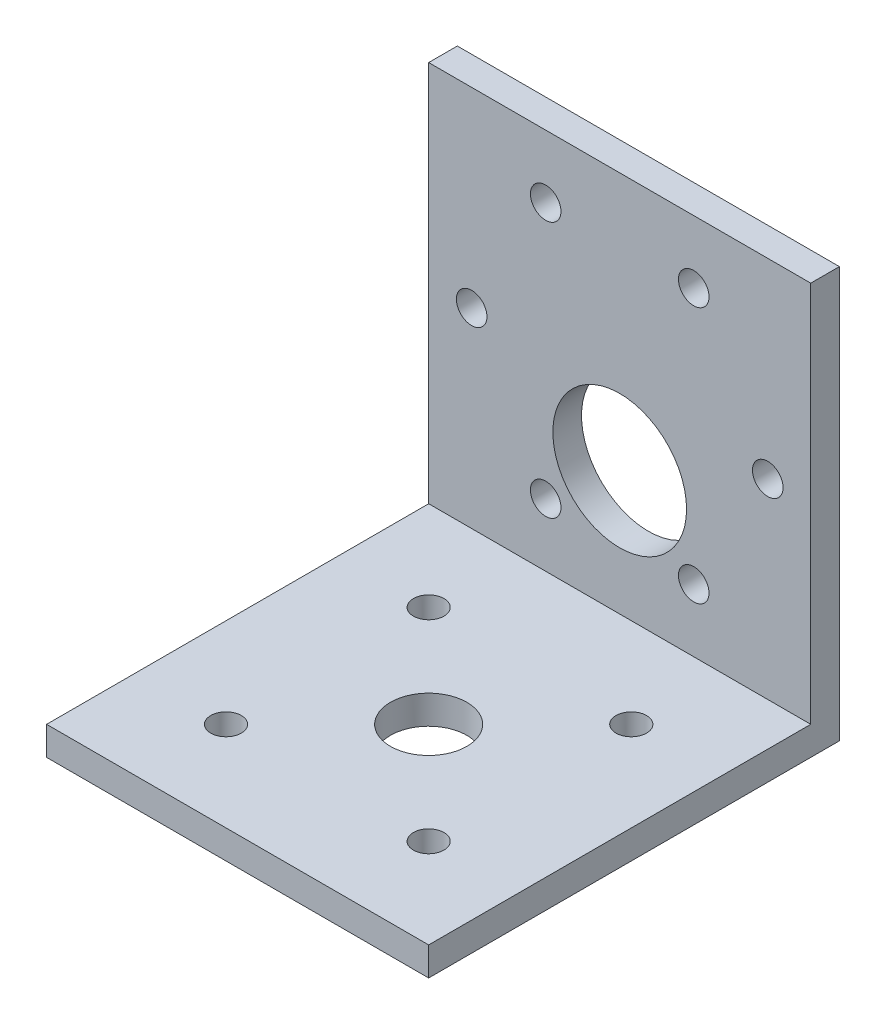
ISO-10303-21;
HEADER;
FILE_DESCRIPTION(('STEP AP214'),'2;1');
FILE_NAME('part.step','',(''),(''),'','','');
FILE_SCHEMA(('AUTOMOTIVE_DESIGN { 1 0 10303 214 1 1 1 1 }'));
ENDSEC;
DATA;
#1=APPLICATION_CONTEXT('core data for automotive mechanical design processes');
#2=APPLICATION_PROTOCOL_DEFINITION('international standard','automotive_design',2000,#1);
#3=PRODUCT_CONTEXT('',#1,'mechanical');
#4=PRODUCT('Part','Part','',(#3));
#5=PRODUCT_RELATED_PRODUCT_CATEGORY('part','',(#4));
#6=PRODUCT_DEFINITION_FORMATION('','',#4);
#7=PRODUCT_DEFINITION_CONTEXT('part definition',#1,'design');
#8=PRODUCT_DEFINITION('design','',#6,#7);
#9=PRODUCT_DEFINITION_SHAPE('','',#8);
#10=(LENGTH_UNIT() NAMED_UNIT(*) SI_UNIT(.MILLI.,.METRE.));
#11=(NAMED_UNIT(*) PLANE_ANGLE_UNIT() SI_UNIT($,.RADIAN.));
#12=(NAMED_UNIT(*) SI_UNIT($,.STERADIAN.) SOLID_ANGLE_UNIT());
#13=UNCERTAINTY_MEASURE_WITH_UNIT(LENGTH_MEASURE(1.E-05),#10,'distance_accuracy_value','');
#14=(GEOMETRIC_REPRESENTATION_CONTEXT(3) GLOBAL_UNCERTAINTY_ASSIGNED_CONTEXT((#13)) GLOBAL_UNIT_ASSIGNED_CONTEXT((#10,
#11,#12)) REPRESENTATION_CONTEXT('',''));
#15=CARTESIAN_POINT('',(0.,0.,0.));
#16=DIRECTION('',(0.,0.,1.));
#17=DIRECTION('',(1.,0.,0.));
#18=AXIS2_PLACEMENT_3D('',#15,#16,#17);
#19=CARTESIAN_POINT('',(0.,0.,3.));
#20=DIRECTION('',(0.,0.,1.));
#21=DIRECTION('',(1.,0.,0.));
#22=AXIS2_PLACEMENT_3D('',#19,#20,#21);
#23=PLANE('',#22);
#24=CARTESIAN_POINT('',(27.75,-33.4233937586588,3.));
#25=DIRECTION('',(0.,0.,1.));
#26=DIRECTION('',(1.,0.,0.));
#27=AXIS2_PLACEMENT_3D('',#24,#25,#26);
#28=CIRCLE('',#27,1.60000000000002);
#29=CARTESIAN_POINT('',(29.35,-33.4233937586588,3.));
#30=VERTEX_POINT('',#29);
#31=EDGE_CURVE('E288',#30,#30,#28,.T.);
#32=ORIENTED_EDGE('',*,*,#31,.F.);
#33=EDGE_LOOP('',(#32));
#34=FACE_BOUND('',#33,.T.);
#35=CARTESIAN_POINT('',(35.5,-20.,3.));
#36=DIRECTION('',(0.,0.,-1.));
#37=DIRECTION('',(-1.,0.,0.));
#38=AXIS2_PLACEMENT_3D('',#35,#36,#37);
#39=CIRCLE('',#38,1.6);
#40=CARTESIAN_POINT('',(33.9,-20.,3.));
#41=VERTEX_POINT('',#40);
#42=EDGE_CURVE('E296',#41,#41,#39,.T.);
#43=ORIENTED_EDGE('',*,*,#42,.T.);
#44=EDGE_LOOP('',(#43));
#45=FACE_BOUND('',#44,.T.);
#46=CARTESIAN_POINT('',(27.75,-6.57660624134121,3.));
#47=DIRECTION('',(0.,0.,-1.));
#48=DIRECTION('',(-1.,0.,0.));
#49=AXIS2_PLACEMENT_3D('',#46,#47,#48);
#50=CIRCLE('',#49,1.60000000000001);
#51=CARTESIAN_POINT('',(26.15,-6.57660624134121,3.));
#52=VERTEX_POINT('',#51);
#53=EDGE_CURVE('E304',#52,#52,#50,.T.);
#54=ORIENTED_EDGE('',*,*,#53,.T.);
#55=EDGE_LOOP('',(#54));
#56=FACE_BOUND('',#55,.T.);
#57=DIRECTION('',(0.,-1.,0.));
#58=VECTOR('',#57,1.);
#59=CARTESIAN_POINT('',(40.,0.,3.));
#60=LINE('',#59,#58);
#61=CARTESIAN_POINT('',(40.,0.,3.));
#62=VERTEX_POINT('',#61);
#63=CARTESIAN_POINT('',(40.,-40.,3.));
#64=VERTEX_POINT('',#63);
#65=EDGE_CURVE('E182',#62,#64,#60,.T.);
#66=ORIENTED_EDGE('',*,*,#65,.F.);
#67=DIRECTION('',(1.,0.,0.));
#68=VECTOR('',#67,1.);
#69=CARTESIAN_POINT('',(0.,0.,3.));
#70=LINE('',#69,#68);
#71=CARTESIAN_POINT('',(0.,0.,3.));
#72=VERTEX_POINT('',#71);
#73=EDGE_CURVE('E190',#72,#62,#70,.T.);
#74=ORIENTED_EDGE('',*,*,#73,.F.);
#75=DIRECTION('',(0.,-1.,0.));
#76=VECTOR('',#75,1.);
#77=CARTESIAN_POINT('',(0.,0.,3.));
#78=LINE('',#77,#76);
#79=CARTESIAN_POINT('',(0.,-40.,3.));
#80=VERTEX_POINT('',#79);
#81=EDGE_CURVE('E197',#72,#80,#78,.T.);
#82=ORIENTED_EDGE('',*,*,#81,.T.);
#83=DIRECTION('',(1.,0.,0.));
#84=VECTOR('',#83,1.);
#85=CARTESIAN_POINT('',(0.,-40.,3.));
#86=LINE('',#85,#84);
#87=EDGE_CURVE('E172',#80,#64,#86,.T.);
#88=ORIENTED_EDGE('',*,*,#87,.T.);
#89=EDGE_LOOP('',(#66,#74,#82,#88));
#90=FACE_BOUND('',#89,.T.);
#91=CARTESIAN_POINT('',(20.,-27.,3.));
#92=DIRECTION('',(0.,0.,1.));
#93=DIRECTION('',(1.,0.,0.));
#94=AXIS2_PLACEMENT_3D('',#91,#92,#93);
#95=CIRCLE('',#94,7.);
#96=CARTESIAN_POINT('',(27.,-27.,3.));
#97=VERTEX_POINT('',#96);
#98=EDGE_CURVE('E192',#97,#97,#95,.T.);
#99=ORIENTED_EDGE('',*,*,#98,.F.);
#100=EDGE_LOOP('',(#99));
#101=FACE_BOUND('',#100,.T.);
#102=CARTESIAN_POINT('',(12.25,-6.57660624134121,3.));
#103=DIRECTION('',(0.,0.,1.));
#104=DIRECTION('',(1.,0.,0.));
#105=AXIS2_PLACEMENT_3D('',#102,#103,#104);
#106=CIRCLE('',#105,1.6);
#107=CARTESIAN_POINT('',(13.85,-6.57660624134121,3.));
#108=VERTEX_POINT('',#107);
#109=EDGE_CURVE('E209',#108,#108,#106,.T.);
#110=ORIENTED_EDGE('',*,*,#109,.F.);
#111=EDGE_LOOP('',(#110));
#112=FACE_BOUND('',#111,.T.);
#113=CARTESIAN_POINT('',(12.25,-33.4233937586588,3.));
#114=DIRECTION('',(0.,0.,-1.));
#115=DIRECTION('',(-1.,0.,0.));
#116=AXIS2_PLACEMENT_3D('',#113,#114,#115);
#117=CIRCLE('',#116,1.60000000000001);
#118=CARTESIAN_POINT('',(10.65,-33.4233937586588,3.));
#119=VERTEX_POINT('',#118);
#120=EDGE_CURVE('E280',#119,#119,#117,.T.);
#121=ORIENTED_EDGE('',*,*,#120,.T.);
#122=EDGE_LOOP('',(#121));
#123=FACE_BOUND('',#122,.T.);
#124=CARTESIAN_POINT('',(4.5,-20.,3.));
#125=DIRECTION('',(0.,0.,1.));
#126=DIRECTION('',(1.,0.,0.));
#127=AXIS2_PLACEMENT_3D('',#124,#125,#126);
#128=CIRCLE('',#127,1.6);
#129=CARTESIAN_POINT('',(6.10000000000001,-20.,3.));
#130=VERTEX_POINT('',#129);
#131=EDGE_CURVE('E272',#130,#130,#128,.T.);
#132=ORIENTED_EDGE('',*,*,#131,.F.);
#133=EDGE_LOOP('',(#132));
#134=FACE_BOUND('',#133,.T.);
#135=ADVANCED_FACE('F137',(#34,#45,#56,#90,#101,#112,#123,#134),#23,.T.);
#136=CARTESIAN_POINT('',(0.,0.,0.));
#137=DIRECTION('',(0.,0.,1.));
#138=DIRECTION('',(1.,0.,0.));
#139=AXIS2_PLACEMENT_3D('',#136,#137,#138);
#140=PLANE('',#139);
#141=CARTESIAN_POINT('',(12.25,-33.4233937586588,0.));
#142=DIRECTION('',(0.,0.,-1.));
#143=DIRECTION('',(-1.,0.,0.));
#144=AXIS2_PLACEMENT_3D('',#141,#142,#143);
#145=CIRCLE('',#144,1.60000000000001);
#146=CARTESIAN_POINT('',(10.65,-33.4233937586588,0.));
#147=VERTEX_POINT('',#146);
#148=EDGE_CURVE('E276',#147,#147,#145,.T.);
#149=ORIENTED_EDGE('',*,*,#148,.F.);
#150=EDGE_LOOP('',(#149));
#151=FACE_BOUND('',#150,.T.);
#152=CARTESIAN_POINT('',(35.5,-20.,0.));
#153=DIRECTION('',(0.,0.,-1.));
#154=DIRECTION('',(-1.,0.,0.));
#155=AXIS2_PLACEMENT_3D('',#152,#153,#154);
#156=CIRCLE('',#155,1.6);
#157=CARTESIAN_POINT('',(33.9,-20.,0.));
#158=VERTEX_POINT('',#157);
#159=EDGE_CURVE('E292',#158,#158,#156,.T.);
#160=ORIENTED_EDGE('',*,*,#159,.F.);
#161=EDGE_LOOP('',(#160));
#162=FACE_BOUND('',#161,.T.);
#163=CARTESIAN_POINT('',(27.75,-6.57660624134121,0.));
#164=DIRECTION('',(0.,0.,-1.));
#165=DIRECTION('',(-1.,0.,0.));
#166=AXIS2_PLACEMENT_3D('',#163,#164,#165);
#167=CIRCLE('',#166,1.60000000000001);
#168=CARTESIAN_POINT('',(26.15,-6.57660624134121,0.));
#169=VERTEX_POINT('',#168);
#170=EDGE_CURVE('E300',#169,#169,#167,.T.);
#171=ORIENTED_EDGE('',*,*,#170,.F.);
#172=EDGE_LOOP('',(#171));
#173=FACE_BOUND('',#172,.T.);
#174=CARTESIAN_POINT('',(20.,-27.,0.));
#175=DIRECTION('',(0.,0.,1.));
#176=DIRECTION('',(1.,0.,0.));
#177=AXIS2_PLACEMENT_3D('',#174,#175,#176);
#178=CIRCLE('',#177,7.);
#179=CARTESIAN_POINT('',(27.,-27.,0.));
#180=VERTEX_POINT('',#179);
#181=EDGE_CURVE('E205',#180,#180,#178,.T.);
#182=ORIENTED_EDGE('',*,*,#181,.T.);
#183=EDGE_LOOP('',(#182));
#184=FACE_BOUND('',#183,.T.);
#185=DIRECTION('',(0.,-1.,0.));
#186=VECTOR('',#185,1.);
#187=CARTESIAN_POINT('',(40.,0.,0.));
#188=LINE('',#187,#186);
#189=CARTESIAN_POINT('',(40.,0.,0.));
#190=VERTEX_POINT('',#189);
#191=CARTESIAN_POINT('',(40.,-43.,0.));
#192=VERTEX_POINT('',#191);
#193=EDGE_CURVE('E184',#190,#192,#188,.T.);
#194=ORIENTED_EDGE('',*,*,#193,.T.);
#195=DIRECTION('',(-1.,0.,0.));
#196=VECTOR('',#195,1.);
#197=CARTESIAN_POINT('',(83.1045241245046,-43.,0.));
#198=LINE('',#197,#196);
#199=CARTESIAN_POINT('',(0.,-43.,0.));
#200=VERTEX_POINT('',#199);
#201=EDGE_CURVE('E229',#192,#200,#198,.T.);
#202=ORIENTED_EDGE('',*,*,#201,.T.);
#203=DIRECTION('',(0.,-1.,0.));
#204=VECTOR('',#203,1.);
#205=CARTESIAN_POINT('',(0.,0.,0.));
#206=LINE('',#205,#204);
#207=CARTESIAN_POINT('',(0.,0.,0.));
#208=VERTEX_POINT('',#207);
#209=EDGE_CURVE('E215',#208,#200,#206,.T.);
#210=ORIENTED_EDGE('',*,*,#209,.F.);
#211=DIRECTION('',(1.,0.,0.));
#212=VECTOR('',#211,1.);
#213=CARTESIAN_POINT('',(0.,0.,0.));
#214=LINE('',#213,#212);
#215=EDGE_CURVE('E212',#208,#190,#214,.T.);
#216=ORIENTED_EDGE('',*,*,#215,.T.);
#217=EDGE_LOOP('',(#194,#202,#210,#216));
#218=FACE_BOUND('',#217,.T.);
#219=CARTESIAN_POINT('',(12.25,-6.57660624134121,0.));
#220=DIRECTION('',(0.,0.,1.));
#221=DIRECTION('',(1.,0.,0.));
#222=AXIS2_PLACEMENT_3D('',#219,#220,#221);
#223=CIRCLE('',#222,1.6);
#224=CARTESIAN_POINT('',(13.85,-6.57660624134121,0.));
#225=VERTEX_POINT('',#224);
#226=EDGE_CURVE('E308',#225,#225,#223,.T.);
#227=ORIENTED_EDGE('',*,*,#226,.T.);
#228=EDGE_LOOP('',(#227));
#229=FACE_BOUND('',#228,.T.);
#230=CARTESIAN_POINT('',(27.75,-33.4233937586588,0.));
#231=DIRECTION('',(0.,0.,1.));
#232=DIRECTION('',(1.,0.,0.));
#233=AXIS2_PLACEMENT_3D('',#230,#231,#232);
#234=CIRCLE('',#233,1.60000000000002);
#235=CARTESIAN_POINT('',(29.35,-33.4233937586588,0.));
#236=VERTEX_POINT('',#235);
#237=EDGE_CURVE('E284',#236,#236,#234,.T.);
#238=ORIENTED_EDGE('',*,*,#237,.T.);
#239=EDGE_LOOP('',(#238));
#240=FACE_BOUND('',#239,.T.);
#241=CARTESIAN_POINT('',(4.5,-20.,0.));
#242=DIRECTION('',(0.,0.,1.));
#243=DIRECTION('',(1.,0.,0.));
#244=AXIS2_PLACEMENT_3D('',#241,#242,#243);
#245=CIRCLE('',#244,1.6);
#246=CARTESIAN_POINT('',(6.10000000000001,-20.,0.));
#247=VERTEX_POINT('',#246);
#248=EDGE_CURVE('E266',#247,#247,#245,.T.);
#249=ORIENTED_EDGE('',*,*,#248,.T.);
#250=EDGE_LOOP('',(#249));
#251=FACE_BOUND('',#250,.T.);
#252=ADVANCED_FACE('F226',(#151,#162,#173,#184,#218,#229,#240,#251),#140,.F.);
#253=CARTESIAN_POINT('',(40.,0.,3.));
#254=DIRECTION('',(1.,0.,0.));
#255=DIRECTION('',(0.,1.,0.));
#256=AXIS2_PLACEMENT_3D('',#253,#254,#255);
#257=PLANE('',#256);
#258=ORIENTED_EDGE('',*,*,#193,.F.);
#259=DIRECTION('',(0.,0.,-1.));
#260=VECTOR('',#259,1.);
#261=CARTESIAN_POINT('',(40.,0.,3.));
#262=LINE('',#261,#260);
#263=EDGE_CURVE('E12',#62,#190,#262,.T.);
#264=ORIENTED_EDGE('',*,*,#263,.F.);
#265=ORIENTED_EDGE('',*,*,#65,.T.);
#266=DIRECTION('',(0.,0.,1.));
#267=VECTOR('',#266,1.);
#268=CARTESIAN_POINT('',(40.,-40.,0.));
#269=LINE('',#268,#267);
#270=CARTESIAN_POINT('',(40.,-40.,43.));
#271=VERTEX_POINT('',#270);
#272=EDGE_CURVE('E155',#64,#271,#269,.T.);
#273=ORIENTED_EDGE('',*,*,#272,.T.);
#274=DIRECTION('',(0.,-1.,0.));
#275=VECTOR('',#274,1.);
#276=CARTESIAN_POINT('',(40.,-40.,43.));
#277=LINE('',#276,#275);
#278=CARTESIAN_POINT('',(40.,-43.,43.));
#279=VERTEX_POINT('',#278);
#280=EDGE_CURVE('E262',#271,#279,#277,.T.);
#281=ORIENTED_EDGE('',*,*,#280,.T.);
#282=DIRECTION('',(0.,0.,-1.));
#283=VECTOR('',#282,1.);
#284=CARTESIAN_POINT('',(40.,-43.,0.));
#285=LINE('',#284,#283);
#286=EDGE_CURVE('E247',#279,#192,#285,.T.);
#287=ORIENTED_EDGE('',*,*,#286,.T.);
#288=EDGE_LOOP('',(#258,#264,#265,#273,#281,#287));
#289=FACE_BOUND('',#288,.T.);
#290=ADVANCED_FACE('F181',(#289),#257,.T.);
#291=CARTESIAN_POINT('',(0.,0.,3.));
#292=DIRECTION('',(0.,1.,0.));
#293=DIRECTION('',(0.,0.,1.));
#294=AXIS2_PLACEMENT_3D('',#291,#292,#293);
#295=PLANE('',#294);
#296=ORIENTED_EDGE('',*,*,#215,.F.);
#297=DIRECTION('',(0.,0.,-1.));
#298=VECTOR('',#297,1.);
#299=CARTESIAN_POINT('',(0.,0.,3.));
#300=LINE('',#299,#298);
#301=EDGE_CURVE('E147',#72,#208,#300,.T.);
#302=ORIENTED_EDGE('',*,*,#301,.F.);
#303=ORIENTED_EDGE('',*,*,#73,.T.);
#304=ORIENTED_EDGE('',*,*,#263,.T.);
#305=EDGE_LOOP('',(#296,#302,#303,#304));
#306=FACE_BOUND('',#305,.T.);
#307=ADVANCED_FACE('F194',(#306),#295,.T.);
#308=CARTESIAN_POINT('',(0.,0.,3.));
#309=DIRECTION('',(1.,0.,0.));
#310=DIRECTION('',(0.,1.,0.));
#311=AXIS2_PLACEMENT_3D('',#308,#309,#310);
#312=PLANE('',#311);
#313=ORIENTED_EDGE('',*,*,#209,.T.);
#314=DIRECTION('',(0.,0.,-1.));
#315=VECTOR('',#314,1.);
#316=CARTESIAN_POINT('',(0.,-43.,0.));
#317=LINE('',#316,#315);
#318=CARTESIAN_POINT('',(0.,-43.,43.));
#319=VERTEX_POINT('',#318);
#320=EDGE_CURVE('E240',#319,#200,#317,.T.);
#321=ORIENTED_EDGE('',*,*,#320,.F.);
#322=DIRECTION('',(0.,-1.,0.));
#323=VECTOR('',#322,1.);
#324=CARTESIAN_POINT('',(0.,-40.,43.));
#325=LINE('',#324,#323);
#326=CARTESIAN_POINT('',(0.,-40.,43.));
#327=VERTEX_POINT('',#326);
#328=EDGE_CURVE('E252',#327,#319,#325,.T.);
#329=ORIENTED_EDGE('',*,*,#328,.F.);
#330=DIRECTION('',(0.,0.,1.));
#331=VECTOR('',#330,1.);
#332=CARTESIAN_POINT('',(0.,-40.,0.));
#333=LINE('',#332,#331);
#334=EDGE_CURVE('E236',#80,#327,#333,.T.);
#335=ORIENTED_EDGE('',*,*,#334,.F.);
#336=ORIENTED_EDGE('',*,*,#81,.F.);
#337=ORIENTED_EDGE('',*,*,#301,.T.);
#338=EDGE_LOOP('',(#313,#321,#329,#335,#336,#337));
#339=FACE_BOUND('',#338,.T.);
#340=ADVANCED_FACE('F221',(#339),#312,.F.);
#341=CARTESIAN_POINT('',(20.,-27.,3.));
#342=DIRECTION('',(0.,0.,-1.));
#343=DIRECTION('',(-1.,0.,0.));
#344=AXIS2_PLACEMENT_3D('',#341,#342,#343);
#345=CYLINDRICAL_SURFACE('',#344,7.);
#346=ORIENTED_EDGE('',*,*,#98,.T.);
#347=EDGE_LOOP('',(#346));
#348=FACE_BOUND('',#347,.T.);
#349=ORIENTED_EDGE('',*,*,#181,.F.);
#350=EDGE_LOOP('',(#349));
#351=FACE_BOUND('',#350,.T.);
#352=ADVANCED_FACE('F139',(#348,#351),#345,.F.);
#353=CARTESIAN_POINT('',(12.25,-6.57660624134121,3.));
#354=DIRECTION('',(0.,0.,-1.));
#355=DIRECTION('',(-1.,0.,0.));
#356=AXIS2_PLACEMENT_3D('',#353,#354,#355);
#357=CYLINDRICAL_SURFACE('',#356,1.6);
#358=ORIENTED_EDGE('',*,*,#109,.T.);
#359=EDGE_LOOP('',(#358));
#360=FACE_BOUND('',#359,.T.);
#361=ORIENTED_EDGE('',*,*,#226,.F.);
#362=EDGE_LOOP('',(#361));
#363=FACE_BOUND('',#362,.T.);
#364=ADVANCED_FACE('F364',(#360,#363),#357,.F.);
#365=CARTESIAN_POINT('',(27.75,-6.57660624134121,3.));
#366=DIRECTION('',(0.,0.,-1.));
#367=DIRECTION('',(-1.,0.,0.));
#368=AXIS2_PLACEMENT_3D('',#365,#366,#367);
#369=CYLINDRICAL_SURFACE('',#368,1.60000000000001);
#370=ORIENTED_EDGE('',*,*,#53,.F.);
#371=EDGE_LOOP('',(#370));
#372=FACE_BOUND('',#371,.T.);
#373=ORIENTED_EDGE('',*,*,#170,.T.);
#374=EDGE_LOOP('',(#373));
#375=FACE_BOUND('',#374,.T.);
#376=ADVANCED_FACE('F371',(#372,#375),#369,.F.);
#377=CARTESIAN_POINT('',(35.5,-20.,3.));
#378=DIRECTION('',(0.,0.,-1.));
#379=DIRECTION('',(-1.,0.,0.));
#380=AXIS2_PLACEMENT_3D('',#377,#378,#379);
#381=CYLINDRICAL_SURFACE('',#380,1.6);
#382=ORIENTED_EDGE('',*,*,#42,.F.);
#383=EDGE_LOOP('',(#382));
#384=FACE_BOUND('',#383,.T.);
#385=ORIENTED_EDGE('',*,*,#159,.T.);
#386=EDGE_LOOP('',(#385));
#387=FACE_BOUND('',#386,.T.);
#388=ADVANCED_FACE('F379',(#384,#387),#381,.F.);
#389=CARTESIAN_POINT('',(27.75,-33.4233937586588,3.));
#390=DIRECTION('',(0.,0.,-1.));
#391=DIRECTION('',(-1.,0.,0.));
#392=AXIS2_PLACEMENT_3D('',#389,#390,#391);
#393=CYLINDRICAL_SURFACE('',#392,1.60000000000002);
#394=ORIENTED_EDGE('',*,*,#31,.T.);
#395=EDGE_LOOP('',(#394));
#396=FACE_BOUND('',#395,.T.);
#397=ORIENTED_EDGE('',*,*,#237,.F.);
#398=EDGE_LOOP('',(#397));
#399=FACE_BOUND('',#398,.T.);
#400=ADVANCED_FACE('F388',(#396,#399),#393,.F.);
#401=CARTESIAN_POINT('',(12.25,-33.4233937586588,3.));
#402=DIRECTION('',(0.,0.,-1.));
#403=DIRECTION('',(-1.,0.,0.));
#404=AXIS2_PLACEMENT_3D('',#401,#402,#403);
#405=CYLINDRICAL_SURFACE('',#404,1.60000000000001);
#406=ORIENTED_EDGE('',*,*,#120,.F.);
#407=EDGE_LOOP('',(#406));
#408=FACE_BOUND('',#407,.T.);
#409=ORIENTED_EDGE('',*,*,#148,.T.);
#410=EDGE_LOOP('',(#409));
#411=FACE_BOUND('',#410,.T.);
#412=ADVANCED_FACE('F336',(#408,#411),#405,.F.);
#413=CARTESIAN_POINT('',(4.5,-20.,3.));
#414=DIRECTION('',(0.,0.,-1.));
#415=DIRECTION('',(-1.,0.,0.));
#416=AXIS2_PLACEMENT_3D('',#413,#414,#415);
#417=CYLINDRICAL_SURFACE('',#416,1.6);
#418=ORIENTED_EDGE('',*,*,#131,.T.);
#419=EDGE_LOOP('',(#418));
#420=FACE_BOUND('',#419,.T.);
#421=ORIENTED_EDGE('',*,*,#248,.F.);
#422=EDGE_LOOP('',(#421));
#423=FACE_BOUND('',#422,.T.);
#424=ADVANCED_FACE('F332',(#420,#423),#417,.F.);
#425=CARTESIAN_POINT('',(83.1045241245046,-40.,0.));
#426=DIRECTION('',(0.,-1.,0.));
#427=DIRECTION('',(0.,0.,-1.));
#428=AXIS2_PLACEMENT_3D('',#425,#426,#427);
#429=PLANE('',#428);
#430=CARTESIAN_POINT('',(30.6066017177982,-40.,33.6066017177982));
#431=DIRECTION('',(0.,-1.,0.));
#432=DIRECTION('',(0.,0.,-1.));
#433=AXIS2_PLACEMENT_3D('',#430,#431,#432);
#434=CIRCLE('',#433,1.6);
#435=CARTESIAN_POINT('',(30.6066017177982,-40.,32.0066017177982));
#436=VERTEX_POINT('',#435);
#437=EDGE_CURVE('E237',#436,#436,#434,.T.);
#438=ORIENTED_EDGE('',*,*,#437,.T.);
#439=EDGE_LOOP('',(#438));
#440=FACE_BOUND('',#439,.T.);
#441=CARTESIAN_POINT('',(30.6066017177982,-40.,12.3933982822018));
#442=DIRECTION('',(0.,-1.,0.));
#443=DIRECTION('',(0.,0.,-1.));
#444=AXIS2_PLACEMENT_3D('',#441,#442,#443);
#445=CIRCLE('',#444,1.60000000000001);
#446=CARTESIAN_POINT('',(30.6066017177982,-40.,10.7933982822018));
#447=VERTEX_POINT('',#446);
#448=EDGE_CURVE('E527',#447,#447,#445,.T.);
#449=ORIENTED_EDGE('',*,*,#448,.T.);
#450=EDGE_LOOP('',(#449));
#451=FACE_BOUND('',#450,.T.);
#452=CARTESIAN_POINT('',(9.39339828220178,-40.,12.3933982822018));
#453=DIRECTION('',(0.,-1.,0.));
#454=DIRECTION('',(0.,0.,-1.));
#455=AXIS2_PLACEMENT_3D('',#452,#453,#454);
#456=CIRCLE('',#455,1.6);
#457=CARTESIAN_POINT('',(9.39339828220178,-40.,10.7933982822018));
#458=VERTEX_POINT('',#457);
#459=EDGE_CURVE('E530',#458,#458,#456,.T.);
#460=ORIENTED_EDGE('',*,*,#459,.T.);
#461=EDGE_LOOP('',(#460));
#462=FACE_BOUND('',#461,.T.);
#463=CARTESIAN_POINT('',(9.3933982822018,-40.,33.6066017177982));
#464=DIRECTION('',(0.,-1.,0.));
#465=DIRECTION('',(0.,0.,-1.));
#466=AXIS2_PLACEMENT_3D('',#463,#464,#465);
#467=CIRCLE('',#466,1.6);
#468=CARTESIAN_POINT('',(9.3933982822018,-40.,32.0066017177982));
#469=VERTEX_POINT('',#468);
#470=EDGE_CURVE('E535',#469,#469,#467,.T.);
#471=ORIENTED_EDGE('',*,*,#470,.T.);
#472=EDGE_LOOP('',(#471));
#473=FACE_BOUND('',#472,.T.);
#474=CARTESIAN_POINT('',(20.,-40.,23.));
#475=DIRECTION('',(0.,-1.,0.));
#476=DIRECTION('',(0.,0.,-1.));
#477=AXIS2_PLACEMENT_3D('',#474,#475,#476);
#478=CIRCLE('',#477,4.);
#479=CARTESIAN_POINT('',(20.,-40.,19.));
#480=VERTEX_POINT('',#479);
#481=EDGE_CURVE('E541',#480,#480,#478,.T.);
#482=ORIENTED_EDGE('',*,*,#481,.T.);
#483=EDGE_LOOP('',(#482));
#484=FACE_BOUND('',#483,.T.);
#485=ORIENTED_EDGE('',*,*,#87,.F.);
#486=ORIENTED_EDGE('',*,*,#334,.T.);
#487=DIRECTION('',(-1.,0.,0.));
#488=VECTOR('',#487,1.);
#489=CARTESIAN_POINT('',(83.1045241245046,-40.,43.));
#490=LINE('',#489,#488);
#491=EDGE_CURVE('E259',#271,#327,#490,.T.);
#492=ORIENTED_EDGE('',*,*,#491,.F.);
#493=ORIENTED_EDGE('',*,*,#272,.F.);
#494=EDGE_LOOP('',(#485,#486,#492,#493));
#495=FACE_BOUND('',#494,.T.);
#496=ADVANCED_FACE('F335',(#440,#451,#462,#473,#484,#495),#429,.F.);
#497=CARTESIAN_POINT('',(83.1045241245046,-40.,43.));
#498=DIRECTION('',(0.,0.,-1.));
#499=DIRECTION('',(-1.,0.,0.));
#500=AXIS2_PLACEMENT_3D('',#497,#498,#499);
#501=PLANE('',#500);
#502=ORIENTED_EDGE('',*,*,#280,.F.);
#503=ORIENTED_EDGE('',*,*,#491,.T.);
#504=ORIENTED_EDGE('',*,*,#328,.T.);
#505=DIRECTION('',(-1.,0.,0.));
#506=VECTOR('',#505,1.);
#507=CARTESIAN_POINT('',(83.1045241245046,-43.,43.));
#508=LINE('',#507,#506);
#509=EDGE_CURVE('E243',#279,#319,#508,.T.);
#510=ORIENTED_EDGE('',*,*,#509,.F.);
#511=EDGE_LOOP('',(#502,#503,#504,#510));
#512=FACE_BOUND('',#511,.T.);
#513=ADVANCED_FACE('F449',(#512),#501,.F.);
#514=CARTESIAN_POINT('',(83.1045241245046,-43.,0.));
#515=DIRECTION('',(0.,1.,0.));
#516=DIRECTION('',(0.,0.,1.));
#517=AXIS2_PLACEMENT_3D('',#514,#515,#516);
#518=PLANE('',#517);
#519=CARTESIAN_POINT('',(30.6066017177982,-43.,33.6066017177982));
#520=DIRECTION('',(0.,1.,0.));
#521=DIRECTION('',(0.,0.,1.));
#522=AXIS2_PLACEMENT_3D('',#519,#520,#521);
#523=CIRCLE('',#522,1.6);
#524=CARTESIAN_POINT('',(30.6066017177982,-43.,35.2066017177982));
#525=VERTEX_POINT('',#524);
#526=EDGE_CURVE('E523',#525,#525,#523,.T.);
#527=ORIENTED_EDGE('',*,*,#526,.T.);
#528=EDGE_LOOP('',(#527));
#529=FACE_BOUND('',#528,.T.);
#530=CARTESIAN_POINT('',(30.6066017177982,-43.,12.3933982822018));
#531=DIRECTION('',(0.,1.,0.));
#532=DIRECTION('',(0.,0.,1.));
#533=AXIS2_PLACEMENT_3D('',#530,#531,#532);
#534=CIRCLE('',#533,1.60000000000001);
#535=CARTESIAN_POINT('',(30.6066017177982,-43.,13.9933982822018));
#536=VERTEX_POINT('',#535);
#537=EDGE_CURVE('E552',#536,#536,#534,.T.);
#538=ORIENTED_EDGE('',*,*,#537,.T.);
#539=EDGE_LOOP('',(#538));
#540=FACE_BOUND('',#539,.T.);
#541=CARTESIAN_POINT('',(9.39339828220178,-43.,12.3933982822018));
#542=DIRECTION('',(0.,1.,0.));
#543=DIRECTION('',(0.,0.,1.));
#544=AXIS2_PLACEMENT_3D('',#541,#542,#543);
#545=CIRCLE('',#544,1.6);
#546=CARTESIAN_POINT('',(9.39339828220178,-43.,13.9933982822018));
#547=VERTEX_POINT('',#546);
#548=EDGE_CURVE('E556',#547,#547,#545,.T.);
#549=ORIENTED_EDGE('',*,*,#548,.T.);
#550=EDGE_LOOP('',(#549));
#551=FACE_BOUND('',#550,.T.);
#552=CARTESIAN_POINT('',(9.3933982822018,-43.,33.6066017177982));
#553=DIRECTION('',(0.,1.,0.));
#554=DIRECTION('',(0.,0.,1.));
#555=AXIS2_PLACEMENT_3D('',#552,#553,#554);
#556=CIRCLE('',#555,1.6);
#557=CARTESIAN_POINT('',(9.3933982822018,-43.,35.2066017177982));
#558=VERTEX_POINT('',#557);
#559=EDGE_CURVE('E549',#558,#558,#556,.T.);
#560=ORIENTED_EDGE('',*,*,#559,.T.);
#561=EDGE_LOOP('',(#560));
#562=FACE_BOUND('',#561,.T.);
#563=CARTESIAN_POINT('',(20.,-43.,23.));
#564=DIRECTION('',(0.,1.,0.));
#565=DIRECTION('',(0.,0.,1.));
#566=AXIS2_PLACEMENT_3D('',#563,#564,#565);
#567=CIRCLE('',#566,4.);
#568=CARTESIAN_POINT('',(20.,-43.,27.));
#569=VERTEX_POINT('',#568);
#570=EDGE_CURVE('E545',#569,#569,#567,.T.);
#571=ORIENTED_EDGE('',*,*,#570,.T.);
#572=EDGE_LOOP('',(#571));
#573=FACE_BOUND('',#572,.T.);
#574=ORIENTED_EDGE('',*,*,#286,.F.);
#575=ORIENTED_EDGE('',*,*,#509,.T.);
#576=ORIENTED_EDGE('',*,*,#320,.T.);
#577=ORIENTED_EDGE('',*,*,#201,.F.);
#578=EDGE_LOOP('',(#574,#575,#576,#577));
#579=FACE_BOUND('',#578,.T.);
#580=ADVANCED_FACE('F241',(#529,#540,#551,#562,#573,#579),#518,.F.);
#581=CARTESIAN_POINT('',(20.,-43.,23.));
#582=DIRECTION('',(0.,1.,0.));
#583=DIRECTION('',(0.,0.,1.));
#584=AXIS2_PLACEMENT_3D('',#581,#582,#583);
#585=CYLINDRICAL_SURFACE('',#584,4.);
#586=ORIENTED_EDGE('',*,*,#570,.F.);
#587=EDGE_LOOP('',(#586));
#588=FACE_BOUND('',#587,.T.);
#589=ORIENTED_EDGE('',*,*,#481,.F.);
#590=EDGE_LOOP('',(#589));
#591=FACE_BOUND('',#590,.T.);
#592=ADVANCED_FACE('F467',(#588,#591),#585,.F.);
#593=CARTESIAN_POINT('',(9.3933982822018,-43.,33.6066017177982));
#594=DIRECTION('',(0.,1.,0.));
#595=DIRECTION('',(0.,0.,1.));
#596=AXIS2_PLACEMENT_3D('',#593,#594,#595);
#597=CYLINDRICAL_SURFACE('',#596,1.6);
#598=ORIENTED_EDGE('',*,*,#559,.F.);
#599=EDGE_LOOP('',(#598));
#600=FACE_BOUND('',#599,.T.);
#601=ORIENTED_EDGE('',*,*,#470,.F.);
#602=EDGE_LOOP('',(#601));
#603=FACE_BOUND('',#602,.T.);
#604=ADVANCED_FACE('F477',(#600,#603),#597,.F.);
#605=CARTESIAN_POINT('',(9.39339828220178,-43.,12.3933982822018));
#606=DIRECTION('',(0.,1.,0.));
#607=DIRECTION('',(0.,0.,1.));
#608=AXIS2_PLACEMENT_3D('',#605,#606,#607);
#609=CYLINDRICAL_SURFACE('',#608,1.6);
#610=ORIENTED_EDGE('',*,*,#548,.F.);
#611=EDGE_LOOP('',(#610));
#612=FACE_BOUND('',#611,.T.);
#613=ORIENTED_EDGE('',*,*,#459,.F.);
#614=EDGE_LOOP('',(#613));
#615=FACE_BOUND('',#614,.T.);
#616=ADVANCED_FACE('F487',(#612,#615),#609,.F.);
#617=CARTESIAN_POINT('',(30.6066017177982,-43.,12.3933982822018));
#618=DIRECTION('',(0.,1.,0.));
#619=DIRECTION('',(0.,0.,1.));
#620=AXIS2_PLACEMENT_3D('',#617,#618,#619);
#621=CYLINDRICAL_SURFACE('',#620,1.60000000000001);
#622=ORIENTED_EDGE('',*,*,#537,.F.);
#623=EDGE_LOOP('',(#622));
#624=FACE_BOUND('',#623,.T.);
#625=ORIENTED_EDGE('',*,*,#448,.F.);
#626=EDGE_LOOP('',(#625));
#627=FACE_BOUND('',#626,.T.);
#628=ADVANCED_FACE('F497',(#624,#627),#621,.F.);
#629=CARTESIAN_POINT('',(30.6066017177982,-43.,33.6066017177982));
#630=DIRECTION('',(0.,1.,0.));
#631=DIRECTION('',(0.,0.,1.));
#632=AXIS2_PLACEMENT_3D('',#629,#630,#631);
#633=CYLINDRICAL_SURFACE('',#632,1.6);
#634=ORIENTED_EDGE('',*,*,#526,.F.);
#635=EDGE_LOOP('',(#634));
#636=FACE_BOUND('',#635,.T.);
#637=ORIENTED_EDGE('',*,*,#437,.F.);
#638=EDGE_LOOP('',(#637));
#639=FACE_BOUND('',#638,.T.);
#640=ADVANCED_FACE('F507',(#636,#639),#633,.F.);
#641=CLOSED_SHELL('',(#135,#252,#290,#307,#340,#352,#364,#376,#388,#400,#412,#424,#496,#513,
#580,#592,#604,#616,#628,#640));
#642=MANIFOLD_SOLID_BREP('B2',#641);
#643=ADVANCED_BREP_SHAPE_REPRESENTATION('',(#18,#642),#14);
#644=SHAPE_DEFINITION_REPRESENTATION(#9,#643);
ENDSEC;
END-ISO-10303-21;
